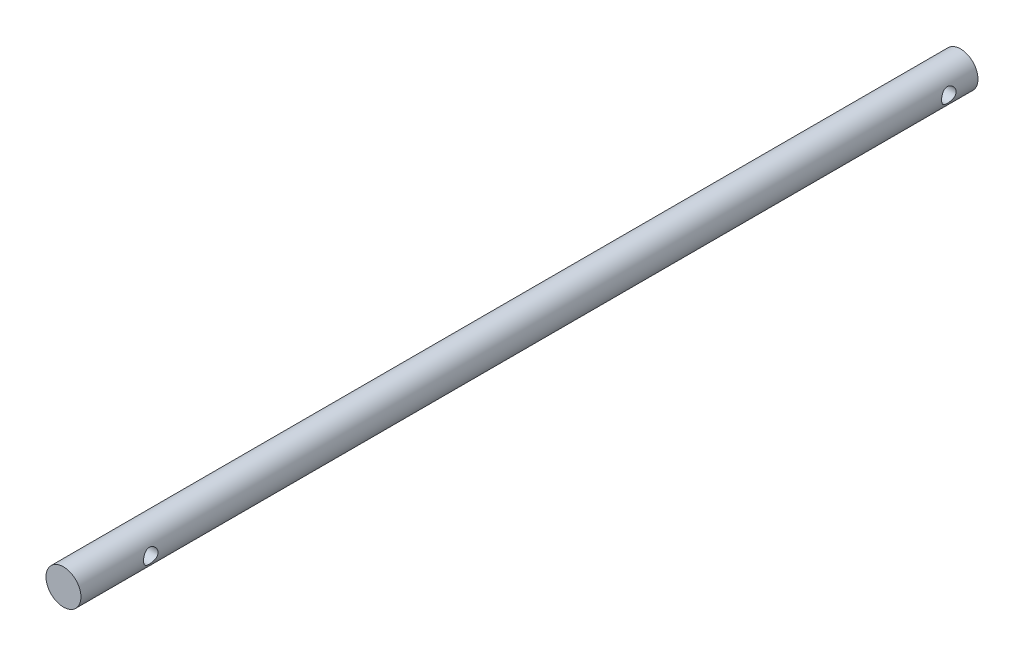
ISO-10303-21;
HEADER;
FILE_DESCRIPTION(('STEP AP214'),'2;1');
FILE_NAME('part.step','',(''),(''),'','','');
FILE_SCHEMA(('AUTOMOTIVE_DESIGN { 1 0 10303 214 1 1 1 1 }'));
ENDSEC;
DATA;
#1=APPLICATION_CONTEXT('core data for automotive mechanical design processes');
#2=APPLICATION_PROTOCOL_DEFINITION('international standard','automotive_design',2000,#1);
#3=PRODUCT_CONTEXT('',#1,'mechanical');
#4=PRODUCT('Part','Part','',(#3));
#5=PRODUCT_RELATED_PRODUCT_CATEGORY('part','',(#4));
#6=PRODUCT_DEFINITION_FORMATION('','',#4);
#7=PRODUCT_DEFINITION_CONTEXT('part definition',#1,'design');
#8=PRODUCT_DEFINITION('design','',#6,#7);
#9=PRODUCT_DEFINITION_SHAPE('','',#8);
#10=(LENGTH_UNIT() NAMED_UNIT(*) SI_UNIT(.MILLI.,.METRE.));
#11=(NAMED_UNIT(*) PLANE_ANGLE_UNIT() SI_UNIT($,.RADIAN.));
#12=(NAMED_UNIT(*) SI_UNIT($,.STERADIAN.) SOLID_ANGLE_UNIT());
#13=UNCERTAINTY_MEASURE_WITH_UNIT(LENGTH_MEASURE(1.E-05),#10,'distance_accuracy_value','');
#14=(GEOMETRIC_REPRESENTATION_CONTEXT(3) GLOBAL_UNCERTAINTY_ASSIGNED_CONTEXT((#13)) GLOBAL_UNIT_ASSIGNED_CONTEXT((#10,
#11,#12)) REPRESENTATION_CONTEXT('',''));
#15=CARTESIAN_POINT('',(0.,0.,0.));
#16=DIRECTION('',(0.,0.,1.));
#17=DIRECTION('',(1.,0.,0.));
#18=AXIS2_PLACEMENT_3D('',#15,#16,#17);
#19=CARTESIAN_POINT('',(0.,0.,154.));
#20=DIRECTION('',(0.,0.,-1.));
#21=DIRECTION('',(-1.,0.,0.));
#22=AXIS2_PLACEMENT_3D('',#19,#20,#21);
#23=CYLINDRICAL_SURFACE('',#22,3.);
#24=CARTESIAN_POINT('',(-3.,0.,6.25));
#25=CARTESIAN_POINT('',(-2.99999458367273,-0.0669580526362665,6.24999279490871));
#26=CARTESIAN_POINT('',(-2.9977323297471,-0.13402139706384,6.24458804147187));
#27=CARTESIAN_POINT('',(-2.98890153579552,-0.266247371156346,6.22316093507982));
#28=CARTESIAN_POINT('',(-2.98232175901028,-0.331404576423564,6.20711087553575));
#29=CARTESIAN_POINT('',(-2.96556289038127,-0.457688733653088,6.16508890821941));
#30=CARTESIAN_POINT('',(-2.95539599975004,-0.518828524426269,6.13915061053185));
#31=CARTESIAN_POINT('',(-2.93245286470664,-0.635829756679803,6.07822717676743));
#32=CARTESIAN_POINT('',(-2.91967741092849,-0.69169279001594,6.04324478102914));
#33=CARTESIAN_POINT('',(-2.89207828351869,-0.799448403559513,5.96337101740912));
#34=CARTESIAN_POINT('',(-2.87718753326093,-0.85104126751777,5.91809869121025));
#35=CARTESIAN_POINT('',(-2.84732714068513,-0.946159821091263,5.81973566521743));
#36=CARTESIAN_POINT('',(-2.83235746106809,-0.989681263153086,5.76664087510549));
#37=CARTESIAN_POINT('',(-2.80321021812995,-1.06953737697066,5.65097322243511));
#38=CARTESIAN_POINT('',(-2.78910786873385,-1.10541308153925,5.58806255157346));
#39=CARTESIAN_POINT('',(-2.76435572357005,-1.16593940588866,5.45642674207907));
#40=CARTESIAN_POINT('',(-2.75370415000823,-1.19059580836291,5.38770462051555));
#41=CARTESIAN_POINT('',(-2.73778555387705,-1.22674598312159,5.24984630823208));
#42=CARTESIAN_POINT('',(-2.73228387651787,-1.23881657877606,5.18088951660785));
#43=CARTESIAN_POINT('',(-2.72661326219504,-1.25125209967796,5.04172670731343));
#44=CARTESIAN_POINT('',(-2.7264413842526,-1.25162348054397,4.97152139997426));
#45=CARTESIAN_POINT('',(-2.73125119560852,-1.24108450363674,4.83759993956506));
#46=CARTESIAN_POINT('',(-2.73583882723623,-1.23103681112301,4.77379890343554));
#47=CARTESIAN_POINT('',(-2.74898482773796,-1.20139191015777,4.64888790899961));
#48=CARTESIAN_POINT('',(-2.75754395703563,-1.18179287287177,4.58777846850823));
#49=CARTESIAN_POINT('',(-2.77786184772756,-1.13321958727571,4.46844229700856));
#50=CARTESIAN_POINT('',(-2.78968481949136,-1.10405471539236,4.41030457908662));
#51=CARTESIAN_POINT('',(-2.81518331141086,-1.03731242580562,4.29952226611985));
#52=CARTESIAN_POINT('',(-2.82885956129779,-0.999731690519545,4.24687984938648));
#53=CARTESIAN_POINT('',(-2.85792976877979,-0.913495965543836,4.14390004126716));
#54=CARTESIAN_POINT('',(-2.87337121404473,-0.864173483207527,4.09413343261456));
#55=CARTESIAN_POINT('',(-2.90325673112529,-0.757729591051513,4.00338649704082));
#56=CARTESIAN_POINT('',(-2.9177005687701,-0.700606359448457,3.96240822830782));
#57=CARTESIAN_POINT('',(-2.94438283556473,-0.578447948693377,3.88956417638373));
#58=CARTESIAN_POINT('',(-2.95656266543334,-0.513260582447681,3.85793055484932));
#59=CARTESIAN_POINT('',(-2.97689481414803,-0.377852402526832,3.80627886039674));
#60=CARTESIAN_POINT('',(-2.985049358458,-0.307634394795035,3.78625436805618));
#61=CARTESIAN_POINT('',(-2.99599641186385,-0.168928113346229,3.75958400787336));
#62=CARTESIAN_POINT('',(-2.99909541047125,-0.10061128527864,3.75217214255625));
#63=CARTESIAN_POINT('',(-3.00056050368745,0.0363546554960886,3.74865377638591));
#64=CARTESIAN_POINT('',(-2.99892795711939,0.105003667152635,3.752544029748));
#65=CARTESIAN_POINT('',(-2.9913121765694,0.237098242341435,3.77097108480607));
#66=CARTESIAN_POINT('',(-2.98554887283989,0.300632966639387,3.7849699540972));
#67=CARTESIAN_POINT('',(-2.97048606772414,0.424382748971091,3.82246819454078));
#68=CARTESIAN_POINT('',(-2.96118611959704,0.484597386518361,3.8459687659503));
#69=CARTESIAN_POINT('',(-2.93958270645166,0.602108999869137,3.90257097571212));
#70=CARTESIAN_POINT('',(-2.92719491469281,0.659257236855324,3.93594818314603));
#71=CARTESIAN_POINT('',(-2.9007380457909,0.76734621623143,4.0110533777917));
#72=CARTESIAN_POINT('',(-2.88666826768733,0.818284352601942,4.05278485152927));
#73=CARTESIAN_POINT('',(-2.85712087895437,0.916333430274265,4.14690323327241));
#74=CARTESIAN_POINT('',(-2.84161451591029,0.962910697979836,4.19983850298626));
#75=CARTESIAN_POINT('',(-2.81184336768005,1.04666984610551,4.31302127593539));
#76=CARTESIAN_POINT('',(-2.79757886493438,1.08384959285617,4.37327043517173));
#77=CARTESIAN_POINT('',(-2.77181386243988,1.14815960208699,4.50061417530258));
#78=CARTESIAN_POINT('',(-2.76035562555111,1.17513918237329,4.56779403551483));
#79=CARTESIAN_POINT('',(-2.74208355658957,1.21717413951573,4.70637059381011));
#80=CARTESIAN_POINT('',(-2.73526589555752,1.23223934863688,4.77776376248335));
#81=CARTESIAN_POINT('',(-2.72763164537264,1.24904080348901,4.91681869919921));
#82=CARTESIAN_POINT('',(-2.72639350967163,1.25171380413129,4.98434466229262));
#83=CARTESIAN_POINT('',(-2.72893853011024,1.24615575523912,5.1188428611411));
#84=CARTESIAN_POINT('',(-2.73272091540306,1.23792637964722,5.1858151803137));
#85=CARTESIAN_POINT('',(-2.74449551302268,1.21158404780491,5.31409274746889));
#86=CARTESIAN_POINT('',(-2.7522835484648,1.19394903571466,5.37551667346339));
#87=CARTESIAN_POINT('',(-2.77103181199189,1.14976328202135,5.49454802135723));
#88=CARTESIAN_POINT('',(-2.78199293131693,1.12321003517252,5.55215436539878));
#89=CARTESIAN_POINT('',(-2.80666954560013,1.0601028593549,5.66569589594912));
#90=CARTESIAN_POINT('',(-2.82051102713679,1.02304360910483,5.72132233016829));
#91=CARTESIAN_POINT('',(-2.84903689053839,0.940684072630392,5.82586013936068));
#92=CARTESIAN_POINT('',(-2.86372156345875,0.895380928905619,5.87476917560057));
#93=CARTESIAN_POINT('',(-2.89356392850106,0.793902045778821,5.96814868168474));
#94=CARTESIAN_POINT('',(-2.90867817511791,0.737174739949028,6.01203643284065));
#95=CARTESIAN_POINT('',(-2.9366014362202,0.616600079253199,6.08969945354363));
#96=CARTESIAN_POINT('',(-2.9494093991674,0.552749497945746,6.12347011488955));
#97=CARTESIAN_POINT('',(-2.97109183362461,0.420732056717951,6.17920984543989));
#98=CARTESIAN_POINT('',(-2.98002782581964,0.352653990980636,6.2013647666173));
#99=CARTESIAN_POINT('',(-2.99321009768625,0.213410421846559,6.23370632907784));
#100=CARTESIAN_POINT('',(-2.99747105811967,0.142255316980957,6.24393044252988));
#101=CARTESIAN_POINT('',(-2.99972287568934,0.0472360819191827,6.24933316108645));
#102=CARTESIAN_POINT('',(-3.00000191102536,0.0236245946756568,6.25000254214923));
#103=CARTESIAN_POINT('',(-3.,0.,6.25));
#104=B_SPLINE_CURVE_WITH_KNOTS('',3,(#24,#25,#26,#27,#28,#29,#30,#31,#32,#33,#34,#35,#36,#37,
#38,#39,#40,#41,#42,#43,#44,#45,#46,#47,#48,#49,#50,#51,#52,#53,#54,#55,#56,#57,#58,#59,#60,#61,
#62,#63,#64,#65,#66,#67,#68,#69,#70,#71,#72,#73,#74,#75,#76,#77,#78,#79,#80,#81,#82,#83,#84,#85,
#86,#87,#88,#89,#90,#91,#92,#93,#94,#95,#96,#97,#98,#99,#100,#101,#102,#103),.UNSPECIFIED.,.T.,
.F.,(4,2,2,2,2,2,2,2,2,2,2,2,2,2,2,2,2,2,2,2,2,2,2,2,2,2,2,2,2,2,2,2,2,2,2,2,2,2,2,4),(0.,
0.200806918883938,0.402138540628697,0.602791851906303,0.803384436852975,1.01317936288807,
1.22308438131466,1.44331724539126,1.66343646730588,1.87295273137558,2.08235338249046,
2.27570157202557,2.46908679727213,2.66658713058715,2.86416545717207,3.07844141127897,
3.29276749314588,3.51204055060814,3.73119224218297,3.93648443393251,4.14171767493172,
4.33676589735722,4.53183876601785,4.73297135272161,4.93418805469496,5.14978488029295,
5.36543061240342,5.58414788359524,5.80268447074581,6.00439877559644,6.20608211297537,
6.39837649964763,6.59072494950613,6.79463893397442,6.99862373425945,7.2174653500489,
7.43640649428583,7.65172855819386,7.86637250469322,7.93722256499099),.UNSPECIFIED.);
#105=CARTESIAN_POINT('',(-3.,0.,6.25));
#106=VERTEX_POINT('',#105);
#107=EDGE_CURVE('E10',#106,#106,#104,.T.);
#108=ORIENTED_EDGE('',*,*,#107,.T.);
#109=EDGE_LOOP('',(#108));
#110=FACE_BOUND('',#109,.T.);
#111=CARTESIAN_POINT('',(3.,0.,3.75));
#112=CARTESIAN_POINT('',(2.99999458367273,-0.0669580526362668,3.7500072050913));
#113=CARTESIAN_POINT('',(2.9977323297471,-0.134021397063841,3.75541195852813));
#114=CARTESIAN_POINT('',(2.98890153579552,-0.266247371156347,3.77683906492018));
#115=CARTESIAN_POINT('',(2.98232175901028,-0.331404576423565,3.79288912446425));
#116=CARTESIAN_POINT('',(2.96556289038127,-0.457688733653088,3.83491109178059));
#117=CARTESIAN_POINT('',(2.95539599975004,-0.518828524426269,3.86084938946815));
#118=CARTESIAN_POINT('',(2.93245286470664,-0.635829756679803,3.92177282323257));
#119=CARTESIAN_POINT('',(2.91967741092849,-0.69169279001594,3.95675521897087));
#120=CARTESIAN_POINT('',(2.89207828351869,-0.799448403559512,4.03662898259088));
#121=CARTESIAN_POINT('',(2.87718753326093,-0.851041267517769,4.08190130878975));
#122=CARTESIAN_POINT('',(2.84732714068513,-0.946159821091263,4.18026433478257));
#123=CARTESIAN_POINT('',(2.83235746106809,-0.989681263153086,4.23335912489451));
#124=CARTESIAN_POINT('',(2.80321021812995,-1.06953737697066,4.3490267775649));
#125=CARTESIAN_POINT('',(2.78910786873385,-1.10541308153925,4.41193744842654));
#126=CARTESIAN_POINT('',(2.76435572357005,-1.16593940588866,4.54357325792093));
#127=CARTESIAN_POINT('',(2.75370415000823,-1.19059580836291,4.61229537948445));
#128=CARTESIAN_POINT('',(2.73778555387705,-1.22674598312159,4.75015369176792));
#129=CARTESIAN_POINT('',(2.73228387651787,-1.23881657877606,4.81911048339215));
#130=CARTESIAN_POINT('',(2.72661326219504,-1.25125209967796,4.95827329268657));
#131=CARTESIAN_POINT('',(2.7264413842526,-1.25162348054397,5.02847860002574));
#132=CARTESIAN_POINT('',(2.73125119560852,-1.24108450363674,5.16240006043494));
#133=CARTESIAN_POINT('',(2.73583882723623,-1.23103681112301,5.22620109656446));
#134=CARTESIAN_POINT('',(2.74898482773796,-1.20139191015777,5.35111209100039));
#135=CARTESIAN_POINT('',(2.75754395703564,-1.18179287287177,5.41222153149177));
#136=CARTESIAN_POINT('',(2.77786184772756,-1.13321958727571,5.53155770299144));
#137=CARTESIAN_POINT('',(2.78968481949136,-1.10405471539236,5.58969542091338));
#138=CARTESIAN_POINT('',(2.81518331141086,-1.03731242580562,5.70047773388015));
#139=CARTESIAN_POINT('',(2.82885956129779,-0.999731690519545,5.75312015061352));
#140=CARTESIAN_POINT('',(2.85792976877979,-0.913495965543836,5.85609995873284));
#141=CARTESIAN_POINT('',(2.87337121404473,-0.864173483207528,5.90586656738544));
#142=CARTESIAN_POINT('',(2.90325673112529,-0.757729591051513,5.99661350295918));
#143=CARTESIAN_POINT('',(2.9177005687701,-0.700606359448458,6.03759177169218));
#144=CARTESIAN_POINT('',(2.94438283556473,-0.578447948693377,6.11043582361627));
#145=CARTESIAN_POINT('',(2.95656266543333,-0.513260582447681,6.14206944515068));
#146=CARTESIAN_POINT('',(2.97689481414803,-0.377852402526832,6.19372113960326));
#147=CARTESIAN_POINT('',(2.985049358458,-0.307634394795036,6.21374563194382));
#148=CARTESIAN_POINT('',(2.99599641186385,-0.168928113346229,6.24041599212664));
#149=CARTESIAN_POINT('',(2.99909541047125,-0.10061128527864,6.24782785744375));
#150=CARTESIAN_POINT('',(3.00056050368745,0.0363546554960887,6.2513462236141));
#151=CARTESIAN_POINT('',(2.99892795711939,0.105003667152635,6.247455970252));
#152=CARTESIAN_POINT('',(2.9913121765694,0.237098242341435,6.22902891519393));
#153=CARTESIAN_POINT('',(2.98554887283989,0.300632966639386,6.2150300459028));
#154=CARTESIAN_POINT('',(2.97048606772414,0.424382748971091,6.17753180545922));
#155=CARTESIAN_POINT('',(2.96118611959704,0.484597386518361,6.1540312340497));
#156=CARTESIAN_POINT('',(2.93958270645166,0.602108999869137,6.09742902428788));
#157=CARTESIAN_POINT('',(2.92719491469281,0.659257236855324,6.06405181685397));
#158=CARTESIAN_POINT('',(2.9007380457909,0.76734621623143,5.98894662220831));
#159=CARTESIAN_POINT('',(2.88666826768733,0.818284352601942,5.94721514847073));
#160=CARTESIAN_POINT('',(2.85712087895437,0.916333430274264,5.85309676672759));
#161=CARTESIAN_POINT('',(2.84161451591029,0.962910697979836,5.80016149701374));
#162=CARTESIAN_POINT('',(2.81184336768005,1.04666984610551,5.68697872406461));
#163=CARTESIAN_POINT('',(2.79757886493438,1.08384959285617,5.62672956482827));
#164=CARTESIAN_POINT('',(2.77181386243988,1.14815960208699,5.49938582469743));
#165=CARTESIAN_POINT('',(2.76035562555111,1.17513918237329,5.43220596448517));
#166=CARTESIAN_POINT('',(2.74208355658957,1.21717413951573,5.2936294061899));
#167=CARTESIAN_POINT('',(2.73526589555752,1.23223934863688,5.22223623751665));
#168=CARTESIAN_POINT('',(2.72763164537264,1.24904080348901,5.08318130080079));
#169=CARTESIAN_POINT('',(2.72639350967162,1.25171380413129,5.01565533770739));
#170=CARTESIAN_POINT('',(2.72893853011024,1.24615575523912,4.8811571388589));
#171=CARTESIAN_POINT('',(2.73272091540306,1.23792637964722,4.81418481968631));
#172=CARTESIAN_POINT('',(2.74449551302268,1.21158404780491,4.68590725253111));
#173=CARTESIAN_POINT('',(2.7522835484648,1.19394903571466,4.62448332653661));
#174=CARTESIAN_POINT('',(2.77103181199189,1.14976328202135,4.50545197864277));
#175=CARTESIAN_POINT('',(2.78199293131693,1.12321003517252,4.44784563460122));
#176=CARTESIAN_POINT('',(2.80666954560013,1.0601028593549,4.33430410405088));
#177=CARTESIAN_POINT('',(2.82051102713679,1.02304360910483,4.27867766983171));
#178=CARTESIAN_POINT('',(2.84903689053839,0.940684072630392,4.17413986063932));
#179=CARTESIAN_POINT('',(2.86372156345875,0.89538092890562,4.12523082439943));
#180=CARTESIAN_POINT('',(2.89356392850106,0.793902045778821,4.03185131831526));
#181=CARTESIAN_POINT('',(2.90867817511791,0.737174739949028,3.98796356715935));
#182=CARTESIAN_POINT('',(2.9366014362202,0.616600079253199,3.91030054645637));
#183=CARTESIAN_POINT('',(2.9494093991674,0.552749497945746,3.87652988511044));
#184=CARTESIAN_POINT('',(2.97109183362461,0.42073205671795,3.82079015456011));
#185=CARTESIAN_POINT('',(2.98002782581964,0.352653990980636,3.7986352333827));
#186=CARTESIAN_POINT('',(2.99321009768625,0.213410421846559,3.76629367092216));
#187=CARTESIAN_POINT('',(2.99747105811967,0.142255316980957,3.75606955747011));
#188=CARTESIAN_POINT('',(2.99972287568934,0.0472360819191832,3.75066683891355));
#189=CARTESIAN_POINT('',(3.00000191102536,0.0236245946756571,3.74999745785078));
#190=CARTESIAN_POINT('',(3.,0.,3.75));
#191=B_SPLINE_CURVE_WITH_KNOTS('',3,(#111,#112,#113,#114,#115,#116,#117,#118,#119,#120,#121,
#122,#123,#124,#125,#126,#127,#128,#129,#130,#131,#132,#133,#134,#135,#136,#137,#138,#139,#140,
#141,#142,#143,#144,#145,#146,#147,#148,#149,#150,#151,#152,#153,#154,#155,#156,#157,#158,#159,
#160,#161,#162,#163,#164,#165,#166,#167,#168,#169,#170,#171,#172,#173,#174,#175,#176,#177,#178,
#179,#180,#181,#182,#183,#184,#185,#186,#187,#188,#189,#190),.UNSPECIFIED.,.T.,.F.,(4,2,2,2,2,2,
2,2,2,2,2,2,2,2,2,2,2,2,2,2,2,2,2,2,2,2,2,2,2,2,2,2,2,2,2,2,2,2,2,4),(0.,0.200806918883939,
0.402138540628697,0.602791851906302,0.803384436852975,1.01317936288807,1.22308438131466,
1.44331724539125,1.66343646730588,1.87295273137558,2.08235338249046,2.27570157202557,
2.46908679727213,2.66658713058715,2.86416545717207,3.07844141127897,3.29276749314588,
3.51204055060813,3.73119224218297,3.93648443393251,4.14171767493172,4.33676589735722,
4.53183876601785,4.73297135272161,4.93418805469496,5.14978488029294,5.36543061240341,
5.58414788359524,5.80268447074581,6.00439877559644,6.20608211297537,6.39837649964763,
6.59072494950613,6.79463893397441,6.99862373425944,7.2174653500489,7.43640649428583,
7.65172855819386,7.86637250469322,7.93722256499098),.UNSPECIFIED.);
#192=CARTESIAN_POINT('',(3.,0.,3.75));
#193=VERTEX_POINT('',#192);
#194=EDGE_CURVE('E42',#193,#193,#191,.T.);
#195=ORIENTED_EDGE('',*,*,#194,.T.);
#196=EDGE_LOOP('',(#195));
#197=FACE_BOUND('',#196,.T.);
#198=CARTESIAN_POINT('',(-3.,0.,143.25));
#199=CARTESIAN_POINT('',(-2.99999458367273,-0.0669580526362663,143.249992794909));
#200=CARTESIAN_POINT('',(-2.9977323297471,-0.134021397063841,143.244588041472));
#201=CARTESIAN_POINT('',(-2.98890153579552,-0.266247371156347,143.22316093508));
#202=CARTESIAN_POINT('',(-2.98232175901028,-0.331404576423564,143.207110875536));
#203=CARTESIAN_POINT('',(-2.96556289038127,-0.457688733653093,143.165088908219));
#204=CARTESIAN_POINT('',(-2.95539599975003,-0.518828524426279,143.139150610532));
#205=CARTESIAN_POINT('',(-2.93245286470664,-0.635829756679811,143.078227176767));
#206=CARTESIAN_POINT('',(-2.91967741092849,-0.691692790015943,143.043244781029));
#207=CARTESIAN_POINT('',(-2.89207828351869,-0.799448403559512,142.963371017409));
#208=CARTESIAN_POINT('',(-2.87718753326093,-0.85104126751777,142.91809869121));
#209=CARTESIAN_POINT('',(-2.84732714068513,-0.946159821091266,142.819735665217));
#210=CARTESIAN_POINT('',(-2.83235746106809,-0.989681263153091,142.766640875105));
#211=CARTESIAN_POINT('',(-2.80321021812995,-1.06953737697066,142.650973222435));
#212=CARTESIAN_POINT('',(-2.78910786873384,-1.10541308153926,142.588062551573));
#213=CARTESIAN_POINT('',(-2.76435572357004,-1.16593940588867,142.456426742079));
#214=CARTESIAN_POINT('',(-2.75370415000823,-1.19059580836292,142.387704620516));
#215=CARTESIAN_POINT('',(-2.73778555387704,-1.2267459831216,142.249846308232));
#216=CARTESIAN_POINT('',(-2.73228387651787,-1.23881657877606,142.180889516608));
#217=CARTESIAN_POINT('',(-2.72661326219503,-1.25125209967798,142.041726707313));
#218=CARTESIAN_POINT('',(-2.72644138425259,-1.25162348054399,141.971521399974));
#219=CARTESIAN_POINT('',(-2.73125119560852,-1.24108450363675,141.837599939565));
#220=CARTESIAN_POINT('',(-2.73583882723622,-1.23103681112302,141.773798903436));
#221=CARTESIAN_POINT('',(-2.74898482773796,-1.20139191015778,141.648887909));
#222=CARTESIAN_POINT('',(-2.75754395703563,-1.18179287287179,141.587778468508));
#223=CARTESIAN_POINT('',(-2.77786184772756,-1.13321958727573,141.468442297009));
#224=CARTESIAN_POINT('',(-2.78968481949136,-1.10405471539237,141.410304579087));
#225=CARTESIAN_POINT('',(-2.81518331141085,-1.03731242580563,141.29952226612));
#226=CARTESIAN_POINT('',(-2.82885956129779,-0.999731690519555,141.246879849386));
#227=CARTESIAN_POINT('',(-2.85792976877979,-0.913495965543841,141.143900041267));
#228=CARTESIAN_POINT('',(-2.87337121404473,-0.864173483207525,141.094133432615));
#229=CARTESIAN_POINT('',(-2.90325673112529,-0.757729591051513,141.003386497041));
#230=CARTESIAN_POINT('',(-2.9177005687701,-0.700606359448466,140.962408228308));
#231=CARTESIAN_POINT('',(-2.94438283556473,-0.578447948693392,140.889564176384));
#232=CARTESIAN_POINT('',(-2.95656266543333,-0.513260582447691,140.857930554849));
#233=CARTESIAN_POINT('',(-2.97689481414803,-0.37785240252684,140.806278860397));
#234=CARTESIAN_POINT('',(-2.985049358458,-0.307634394795046,140.786254368056));
#235=CARTESIAN_POINT('',(-2.99599641186385,-0.16892811334624,140.759584007873));
#236=CARTESIAN_POINT('',(-2.99909541047125,-0.100611285278651,140.752172142556));
#237=CARTESIAN_POINT('',(-3.00056050368745,0.0363546554960758,140.748653776386));
#238=CARTESIAN_POINT('',(-2.99892795711939,0.105003667152621,140.752544029748));
#239=CARTESIAN_POINT('',(-2.9913121765694,0.23709824234142,140.770971084806));
#240=CARTESIAN_POINT('',(-2.9855488728399,0.300632966639372,140.784969954097));
#241=CARTESIAN_POINT('',(-2.97048606772414,0.424382748971077,140.822468194541));
#242=CARTESIAN_POINT('',(-2.96118611959704,0.484597386518347,140.84596876595));
#243=CARTESIAN_POINT('',(-2.93958270645166,0.602108999869129,140.902570975712));
#244=CARTESIAN_POINT('',(-2.92719491469281,0.659257236855323,140.935948183146));
#245=CARTESIAN_POINT('',(-2.9007380457909,0.767346216231433,141.011053377792));
#246=CARTESIAN_POINT('',(-2.88666826768733,0.818284352601942,141.052784851529));
#247=CARTESIAN_POINT('',(-2.85712087895437,0.916333430274263,141.146903233272));
#248=CARTESIAN_POINT('',(-2.84161451591029,0.962910697979835,141.199838502986));
#249=CARTESIAN_POINT('',(-2.81184336768005,1.04666984610551,141.313021275935));
#250=CARTESIAN_POINT('',(-2.79757886493438,1.08384959285618,141.373270435172));
#251=CARTESIAN_POINT('',(-2.77181386243988,1.148159602087,141.500614175303));
#252=CARTESIAN_POINT('',(-2.76035562555111,1.17513918237329,141.567794035515));
#253=CARTESIAN_POINT('',(-2.74208355658957,1.21717413951574,141.70637059381));
#254=CARTESIAN_POINT('',(-2.73526589555752,1.23223934863688,141.777763762483));
#255=CARTESIAN_POINT('',(-2.72763164537263,1.24904080348902,141.916818699199));
#256=CARTESIAN_POINT('',(-2.72639350967162,1.2517138041313,141.984344662293));
#257=CARTESIAN_POINT('',(-2.72893853011023,1.24615575523914,142.118842861141));
#258=CARTESIAN_POINT('',(-2.73272091540306,1.23792637964723,142.185815180314));
#259=CARTESIAN_POINT('',(-2.74449551302267,1.21158404780493,142.314092747469));
#260=CARTESIAN_POINT('',(-2.75228354846479,1.19394903571468,142.375516673463));
#261=CARTESIAN_POINT('',(-2.77103181199188,1.14976328202137,142.494548021357));
#262=CARTESIAN_POINT('',(-2.78199293131693,1.12321003517254,142.552154365399));
#263=CARTESIAN_POINT('',(-2.80666954560012,1.06010285935491,142.665695895949));
#264=CARTESIAN_POINT('',(-2.82051102713678,1.02304360910486,142.721322330168));
#265=CARTESIAN_POINT('',(-2.84903689053838,0.940684072630426,142.825860139361));
#266=CARTESIAN_POINT('',(-2.86372156345874,0.895380928905655,142.874769175601));
#267=CARTESIAN_POINT('',(-2.89356392850105,0.793902045778856,142.968148681685));
#268=CARTESIAN_POINT('',(-2.90867817511791,0.737174739949059,143.012036432841));
#269=CARTESIAN_POINT('',(-2.93660143622019,0.616600079253225,143.089699453544));
#270=CARTESIAN_POINT('',(-2.9494093991674,0.55274949794577,143.12347011489));
#271=CARTESIAN_POINT('',(-2.9710918336246,0.420732056717968,143.17920984544));
#272=CARTESIAN_POINT('',(-2.98002782581964,0.35265399098065,143.201364766617));
#273=CARTESIAN_POINT('',(-2.99321009768624,0.213410421846571,143.233706329078));
#274=CARTESIAN_POINT('',(-2.99747105811967,0.142255316980972,143.24393044253));
#275=CARTESIAN_POINT('',(-2.99972287568934,0.0472360819191941,143.249333161086));
#276=CARTESIAN_POINT('',(-3.00000191102536,0.0236245946756625,143.250002542149));
#277=CARTESIAN_POINT('',(-3.,0.,143.25));
#278=B_SPLINE_CURVE_WITH_KNOTS('',3,(#198,#199,#200,#201,#202,#203,#204,#205,#206,#207,#208,
#209,#210,#211,#212,#213,#214,#215,#216,#217,#218,#219,#220,#221,#222,#223,#224,#225,#226,#227,
#228,#229,#230,#231,#232,#233,#234,#235,#236,#237,#238,#239,#240,#241,#242,#243,#244,#245,#246,
#247,#248,#249,#250,#251,#252,#253,#254,#255,#256,#257,#258,#259,#260,#261,#262,#263,#264,#265,
#266,#267,#268,#269,#270,#271,#272,#273,#274,#275,#276,#277),.UNSPECIFIED.,.T.,.F.,(4,2,2,2,2,2,
2,2,2,2,2,2,2,2,2,2,2,2,2,2,2,2,2,2,2,2,2,2,2,2,2,2,2,2,2,2,2,2,2,4),(0.,0.200806918883936,
0.402138540628697,0.602791851906314,0.803384436852969,1.01317936288809,1.22308438131467,
1.44331724539125,1.66343646730591,1.87295273137558,2.08235338249047,2.27570157202558,
2.46908679727214,2.66658713058716,2.8641654571721,3.078441411279,3.29276749314591,
3.51204055060816,3.731192242183,3.93648443393254,4.14171767493174,4.33676589735723,
4.53183876601788,4.73297135272164,4.93418805469499,5.14978488029298,5.36543061240345,
5.58414788359527,5.80268447074585,6.00439877559646,6.2060821129754,6.39837649964766,
6.59072494950617,6.79463893397443,6.99862373425945,7.21746535004892,7.43640649428588,
7.65172855819391,7.86637250469327,7.93722256499105),.UNSPECIFIED.);
#279=CARTESIAN_POINT('',(-3.,0.,143.25));
#280=VERTEX_POINT('',#279);
#281=EDGE_CURVE('E46',#280,#280,#278,.T.);
#282=ORIENTED_EDGE('',*,*,#281,.T.);
#283=EDGE_LOOP('',(#282));
#284=FACE_BOUND('',#283,.T.);
#285=CARTESIAN_POINT('',(3.,0.,140.75));
#286=CARTESIAN_POINT('',(2.99999458367273,-0.0669580526362669,140.750007205091));
#287=CARTESIAN_POINT('',(2.9977323297471,-0.134021397063841,140.755411958528));
#288=CARTESIAN_POINT('',(2.98890153579552,-0.266247371156348,140.77683906492));
#289=CARTESIAN_POINT('',(2.98232175901028,-0.331404576423565,140.792889124464));
#290=CARTESIAN_POINT('',(2.96556289038127,-0.457688733653089,140.834911091781));
#291=CARTESIAN_POINT('',(2.95539599975004,-0.518828524426271,140.860849389468));
#292=CARTESIAN_POINT('',(2.93245286470664,-0.635829756679803,140.921772823233));
#293=CARTESIAN_POINT('',(2.91967741092849,-0.69169279001594,140.956755218971));
#294=CARTESIAN_POINT('',(2.89207828351869,-0.799448403559513,141.036628982591));
#295=CARTESIAN_POINT('',(2.87718753326093,-0.85104126751777,141.08190130879));
#296=CARTESIAN_POINT('',(2.84732714068513,-0.946159821091266,141.180264334783));
#297=CARTESIAN_POINT('',(2.83235746106809,-0.989681263153091,141.233359124894));
#298=CARTESIAN_POINT('',(2.80321021812995,-1.06953737697066,141.349026777565));
#299=CARTESIAN_POINT('',(2.78910786873384,-1.10541308153926,141.411937448426));
#300=CARTESIAN_POINT('',(2.76435572357004,-1.16593940588867,141.543573257921));
#301=CARTESIAN_POINT('',(2.75370415000823,-1.19059580836292,141.612295379484));
#302=CARTESIAN_POINT('',(2.73778555387704,-1.2267459831216,141.750153691768));
#303=CARTESIAN_POINT('',(2.73228387651786,-1.23881657877607,141.819110483392));
#304=CARTESIAN_POINT('',(2.72661326219503,-1.25125209967798,141.958273292687));
#305=CARTESIAN_POINT('',(2.72644138425259,-1.25162348054399,142.028478600026));
#306=CARTESIAN_POINT('',(2.73125119560852,-1.24108450363675,142.162400060435));
#307=CARTESIAN_POINT('',(2.73583882723622,-1.23103681112302,142.226201096564));
#308=CARTESIAN_POINT('',(2.74898482773796,-1.20139191015778,142.351112091));
#309=CARTESIAN_POINT('',(2.75754395703563,-1.18179287287179,142.412221531492));
#310=CARTESIAN_POINT('',(2.77786184772756,-1.13321958727573,142.531557702991));
#311=CARTESIAN_POINT('',(2.78968481949136,-1.10405471539237,142.589695420913));
#312=CARTESIAN_POINT('',(2.81518331141085,-1.03731242580563,142.70047773388));
#313=CARTESIAN_POINT('',(2.82885956129779,-0.999731690519555,142.753120150614));
#314=CARTESIAN_POINT('',(2.85792976877979,-0.913495965543841,142.856099958733));
#315=CARTESIAN_POINT('',(2.87337121404473,-0.864173483207525,142.905866567385));
#316=CARTESIAN_POINT('',(2.90325673112529,-0.757729591051513,142.996613502959));
#317=CARTESIAN_POINT('',(2.9177005687701,-0.700606359448466,143.037591771692));
#318=CARTESIAN_POINT('',(2.94438283556473,-0.578447948693391,143.110435823616));
#319=CARTESIAN_POINT('',(2.95656266543333,-0.51326058244769,143.142069445151));
#320=CARTESIAN_POINT('',(2.97689481414803,-0.377852402526839,143.193721139603));
#321=CARTESIAN_POINT('',(2.985049358458,-0.307634394795043,143.213745631944));
#322=CARTESIAN_POINT('',(2.99599641186385,-0.168928113346238,143.240415992127));
#323=CARTESIAN_POINT('',(2.99909541047125,-0.100611285278649,143.247827857444));
#324=CARTESIAN_POINT('',(3.00056050368745,0.0363546554960788,143.251346223614));
#325=CARTESIAN_POINT('',(2.99892795711939,0.105003667152624,143.247455970252));
#326=CARTESIAN_POINT('',(2.9913121765694,0.237098242341424,143.229028915194));
#327=CARTESIAN_POINT('',(2.9855488728399,0.300632966639377,143.215030045903));
#328=CARTESIAN_POINT('',(2.97048606772414,0.424382748971083,143.177531805459));
#329=CARTESIAN_POINT('',(2.96118611959704,0.484597386518353,143.15403123405));
#330=CARTESIAN_POINT('',(2.93958270645166,0.602108999869133,143.097429024288));
#331=CARTESIAN_POINT('',(2.92719491469281,0.659257236855327,143.064051816854));
#332=CARTESIAN_POINT('',(2.9007380457909,0.767346216231435,142.988946622208));
#333=CARTESIAN_POINT('',(2.88666826768733,0.818284352601944,142.947215148471));
#334=CARTESIAN_POINT('',(2.85712087895437,0.916333430274264,142.853096766728));
#335=CARTESIAN_POINT('',(2.84161451591029,0.962910697979835,142.800161497014));
#336=CARTESIAN_POINT('',(2.81184336768005,1.04666984610551,142.686978724065));
#337=CARTESIAN_POINT('',(2.79757886493438,1.08384959285618,142.626729564828));
#338=CARTESIAN_POINT('',(2.77181386243988,1.148159602087,142.499385824697));
#339=CARTESIAN_POINT('',(2.76035562555111,1.1751391823733,142.432205964485));
#340=CARTESIAN_POINT('',(2.74208355658956,1.21717413951574,142.29362940619));
#341=CARTESIAN_POINT('',(2.73526589555751,1.23223934863689,142.222236237517));
#342=CARTESIAN_POINT('',(2.72763164537263,1.24904080348902,142.083181300801));
#343=CARTESIAN_POINT('',(2.72639350967162,1.2517138041313,142.015655337707));
#344=CARTESIAN_POINT('',(2.72893853011023,1.24615575523914,141.881157138859));
#345=CARTESIAN_POINT('',(2.73272091540306,1.23792637964723,141.814184819686));
#346=CARTESIAN_POINT('',(2.74449551302267,1.21158404780493,141.685907252531));
#347=CARTESIAN_POINT('',(2.75228354846479,1.19394903571468,141.624483326537));
#348=CARTESIAN_POINT('',(2.77103181199188,1.14976328202137,141.505451978643));
#349=CARTESIAN_POINT('',(2.78199293131693,1.12321003517254,141.447845634601));
#350=CARTESIAN_POINT('',(2.80666954560012,1.06010285935491,141.334304104051));
#351=CARTESIAN_POINT('',(2.82051102713678,1.02304360910486,141.278677669832));
#352=CARTESIAN_POINT('',(2.84903689053838,0.940684072630426,141.174139860639));
#353=CARTESIAN_POINT('',(2.86372156345874,0.895380928905655,141.125230824399));
#354=CARTESIAN_POINT('',(2.89356392850105,0.793902045778856,141.031851318315));
#355=CARTESIAN_POINT('',(2.90867817511791,0.737174739949059,140.987963567159));
#356=CARTESIAN_POINT('',(2.93660143622019,0.616600079253224,140.910300546456));
#357=CARTESIAN_POINT('',(2.9494093991674,0.552749497945769,140.87652988511));
#358=CARTESIAN_POINT('',(2.9710918336246,0.420732056717966,140.82079015456));
#359=CARTESIAN_POINT('',(2.98002782581964,0.352653990980648,140.798635233383));
#360=CARTESIAN_POINT('',(2.99321009768624,0.213410421846568,140.766293670922));
#361=CARTESIAN_POINT('',(2.99747105811967,0.142255316980968,140.75606955747));
#362=CARTESIAN_POINT('',(2.99972287568934,0.0472360819191911,140.750666838914));
#363=CARTESIAN_POINT('',(3.00000191102536,0.0236245946756607,140.749997457851));
#364=CARTESIAN_POINT('',(3.,0.,140.75));
#365=B_SPLINE_CURVE_WITH_KNOTS('',3,(#285,#286,#287,#288,#289,#290,#291,#292,#293,#294,#295,
#296,#297,#298,#299,#300,#301,#302,#303,#304,#305,#306,#307,#308,#309,#310,#311,#312,#313,#314,
#315,#316,#317,#318,#319,#320,#321,#322,#323,#324,#325,#326,#327,#328,#329,#330,#331,#332,#333,
#334,#335,#336,#337,#338,#339,#340,#341,#342,#343,#344,#345,#346,#347,#348,#349,#350,#351,#352,
#353,#354,#355,#356,#357,#358,#359,#360,#361,#362,#363,#364),.UNSPECIFIED.,.T.,.F.,(4,2,2,2,2,2,
2,2,2,2,2,2,2,2,2,2,2,2,2,2,2,2,2,2,2,2,2,2,2,2,2,2,2,2,2,2,2,2,2,4),(0.,0.200806918883936,
0.402138540628697,0.602791851906304,0.803384436852968,1.01317936288809,1.22308438131467,
1.44331724539125,1.66343646730591,1.87295273137561,2.0823533824905,2.27570157202558,
2.46908679727214,2.66658713058716,2.8641654571721,3.078441411279,3.29276749314591,
3.51204055060816,3.731192242183,3.93648443393254,4.14171767493175,4.33676589735724,
4.53183876601789,4.73297135272164,4.93418805469499,5.14978488029298,5.36543061240345,
5.5841478835953,5.80268447074588,6.00439877559646,6.2060821129754,6.39837649964766,
6.59072494950617,6.79463893397443,6.99862373425946,7.21746535004892,7.43640649428588,
7.65172855819392,7.86637250469327,7.93722256499106),.UNSPECIFIED.);
#366=CARTESIAN_POINT('',(3.,0.,140.75));
#367=VERTEX_POINT('',#366);
#368=EDGE_CURVE('E50',#367,#367,#365,.T.);
#369=ORIENTED_EDGE('',*,*,#368,.T.);
#370=EDGE_LOOP('',(#369));
#371=FACE_BOUND('',#370,.T.);
#372=CARTESIAN_POINT('',(0.,0.,154.));
#373=DIRECTION('',(0.,0.,1.));
#374=DIRECTION('',(1.,0.,0.));
#375=AXIS2_PLACEMENT_3D('',#372,#373,#374);
#376=CIRCLE('',#375,3.);
#377=CARTESIAN_POINT('',(3.,0.,154.));
#378=VERTEX_POINT('',#377);
#379=EDGE_CURVE('E78',#378,#378,#376,.T.);
#380=ORIENTED_EDGE('',*,*,#379,.F.);
#381=EDGE_LOOP('',(#380));
#382=FACE_BOUND('',#381,.T.);
#383=CARTESIAN_POINT('',(0.,0.,0.));
#384=DIRECTION('',(0.,0.,1.));
#385=DIRECTION('',(1.,0.,0.));
#386=AXIS2_PLACEMENT_3D('',#383,#384,#385);
#387=CIRCLE('',#386,3.);
#388=CARTESIAN_POINT('',(3.,0.,0.));
#389=VERTEX_POINT('',#388);
#390=EDGE_CURVE('E79',#389,#389,#387,.T.);
#391=ORIENTED_EDGE('',*,*,#390,.T.);
#392=EDGE_LOOP('',(#391));
#393=FACE_BOUND('',#392,.T.);
#394=ADVANCED_FACE('F31',(#110,#197,#284,#371,#382,#393),#23,.T.);
#395=CARTESIAN_POINT('',(0.,0.,154.));
#396=DIRECTION('',(0.,0.,1.));
#397=DIRECTION('',(1.,0.,0.));
#398=AXIS2_PLACEMENT_3D('',#395,#396,#397);
#399=PLANE('',#398);
#400=ORIENTED_EDGE('',*,*,#379,.T.);
#401=EDGE_LOOP('',(#400));
#402=FACE_BOUND('',#401,.T.);
#403=ADVANCED_FACE('F71',(#402),#399,.T.);
#404=CARTESIAN_POINT('',(0.,0.,0.));
#405=DIRECTION('',(0.,0.,1.));
#406=DIRECTION('',(1.,0.,0.));
#407=AXIS2_PLACEMENT_3D('',#404,#405,#406);
#408=PLANE('',#407);
#409=ORIENTED_EDGE('',*,*,#390,.F.);
#410=EDGE_LOOP('',(#409));
#411=FACE_BOUND('',#410,.T.);
#412=ADVANCED_FACE('F69',(#411),#408,.F.);
#413=CARTESIAN_POINT('',(-3.,0.,142.));
#414=DIRECTION('',(1.,0.,0.));
#415=DIRECTION('',(0.,0.,-1.));
#416=AXIS2_PLACEMENT_3D('',#413,#414,#415);
#417=CYLINDRICAL_SURFACE('',#416,1.25000000000001);
#418=ORIENTED_EDGE('',*,*,#368,.F.);
#419=EDGE_LOOP('',(#418));
#420=FACE_BOUND('',#419,.T.);
#421=ORIENTED_EDGE('',*,*,#281,.F.);
#422=EDGE_LOOP('',(#421));
#423=FACE_BOUND('',#422,.T.);
#424=ADVANCED_FACE('F63',(#420,#423),#417,.F.);
#425=CARTESIAN_POINT('',(-3.,0.,5.));
#426=DIRECTION('',(1.,0.,0.));
#427=DIRECTION('',(0.,0.,-1.));
#428=AXIS2_PLACEMENT_3D('',#425,#426,#427);
#429=CYLINDRICAL_SURFACE('',#428,1.25);
#430=ORIENTED_EDGE('',*,*,#194,.F.);
#431=EDGE_LOOP('',(#430));
#432=FACE_BOUND('',#431,.T.);
#433=ORIENTED_EDGE('',*,*,#107,.F.);
#434=EDGE_LOOP('',(#433));
#435=FACE_BOUND('',#434,.T.);
#436=ADVANCED_FACE('F60',(#432,#435),#429,.F.);
#437=CLOSED_SHELL('',(#394,#403,#412,#424,#436));
#438=MANIFOLD_SOLID_BREP('B2',#437);
#439=ADVANCED_BREP_SHAPE_REPRESENTATION('',(#18,#438),#14);
#440=SHAPE_DEFINITION_REPRESENTATION(#9,#439);
ENDSEC;
END-ISO-10303-21;
